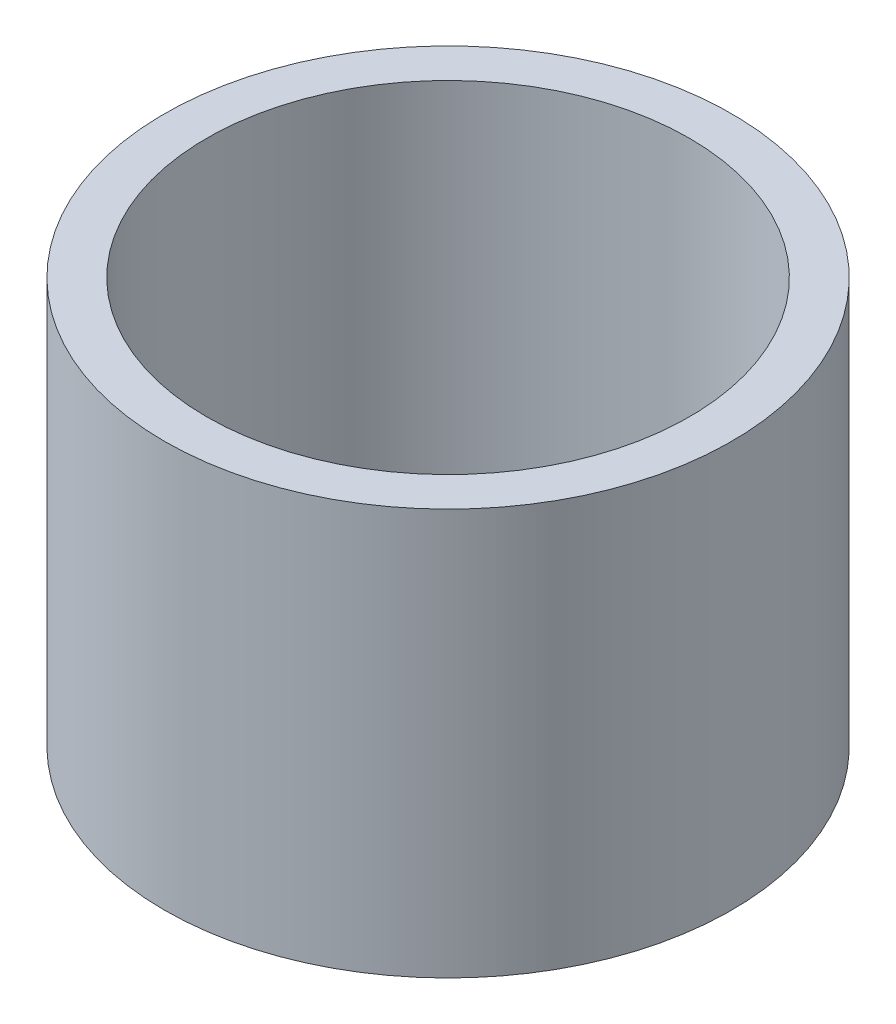
ISO-10303-21;
HEADER;
FILE_DESCRIPTION(('STEP AP214'),'2;1');
FILE_NAME('part.step','',(''),(''),'','','');
FILE_SCHEMA(('AUTOMOTIVE_DESIGN { 1 0 10303 214 1 1 1 1 }'));
ENDSEC;
DATA;
#1=APPLICATION_CONTEXT('core data for automotive mechanical design processes');
#2=APPLICATION_PROTOCOL_DEFINITION('international standard','automotive_design',2000,#1);
#3=PRODUCT_CONTEXT('',#1,'mechanical');
#4=PRODUCT('Part','Part','',(#3));
#5=PRODUCT_RELATED_PRODUCT_CATEGORY('part','',(#4));
#6=PRODUCT_DEFINITION_FORMATION('','',#4);
#7=PRODUCT_DEFINITION_CONTEXT('part definition',#1,'design');
#8=PRODUCT_DEFINITION('design','',#6,#7);
#9=PRODUCT_DEFINITION_SHAPE('','',#8);
#10=(LENGTH_UNIT() NAMED_UNIT(*) SI_UNIT(.MILLI.,.METRE.));
#11=(NAMED_UNIT(*) PLANE_ANGLE_UNIT() SI_UNIT($,.RADIAN.));
#12=(NAMED_UNIT(*) SI_UNIT($,.STERADIAN.) SOLID_ANGLE_UNIT());
#13=UNCERTAINTY_MEASURE_WITH_UNIT(LENGTH_MEASURE(1.E-05),#10,'distance_accuracy_value','');
#14=(GEOMETRIC_REPRESENTATION_CONTEXT(3) GLOBAL_UNCERTAINTY_ASSIGNED_CONTEXT((#13)) GLOBAL_UNIT_ASSIGNED_CONTEXT((#10,
#11,#12)) REPRESENTATION_CONTEXT('',''));
#15=CARTESIAN_POINT('',(0.,0.,0.));
#16=DIRECTION('',(0.,0.,1.));
#17=DIRECTION('',(1.,0.,0.));
#18=AXIS2_PLACEMENT_3D('',#15,#16,#17);
#19=CARTESIAN_POINT('',(0.,50.,0.));
#20=DIRECTION('',(0.,1.,0.));
#21=DIRECTION('',(0.,0.,1.));
#22=AXIS2_PLACEMENT_3D('',#19,#20,#21);
#23=PLANE('',#22);
#24=CARTESIAN_POINT('',(0.,50.,0.));
#25=DIRECTION('',(0.,1.,0.));
#26=DIRECTION('',(0.,0.,1.));
#27=AXIS2_PLACEMENT_3D('',#24,#25,#26);
#28=CIRCLE('',#27,34.93);
#29=CARTESIAN_POINT('',(0.,50.,34.93));
#30=VERTEX_POINT('',#29);
#31=EDGE_CURVE('E10',#30,#30,#28,.T.);
#32=ORIENTED_EDGE('',*,*,#31,.T.);
#33=EDGE_LOOP('',(#32));
#34=FACE_BOUND('',#33,.T.);
#35=CARTESIAN_POINT('',(0.,50.,0.));
#36=DIRECTION('',(0.,1.,0.));
#37=DIRECTION('',(0.,0.,1.));
#38=AXIS2_PLACEMENT_3D('',#35,#36,#37);
#39=CIRCLE('',#38,29.72);
#40=CARTESIAN_POINT('',(0.,50.,29.72));
#41=VERTEX_POINT('',#40);
#42=EDGE_CURVE('E48',#41,#41,#39,.T.);
#43=ORIENTED_EDGE('',*,*,#42,.F.);
#44=EDGE_LOOP('',(#43));
#45=FACE_BOUND('',#44,.T.);
#46=ADVANCED_FACE('F37',(#34,#45),#23,.T.);
#47=CARTESIAN_POINT('',(0.,0.,0.));
#48=DIRECTION('',(0.,1.,0.));
#49=DIRECTION('',(0.,0.,1.));
#50=AXIS2_PLACEMENT_3D('',#47,#48,#49);
#51=PLANE('',#50);
#52=CARTESIAN_POINT('',(0.,0.,0.));
#53=DIRECTION('',(0.,1.,0.));
#54=DIRECTION('',(0.,0.,1.));
#55=AXIS2_PLACEMENT_3D('',#52,#53,#54);
#56=CIRCLE('',#55,34.93);
#57=CARTESIAN_POINT('',(0.,0.,34.93));
#58=VERTEX_POINT('',#57);
#59=EDGE_CURVE('E41',#58,#58,#56,.T.);
#60=ORIENTED_EDGE('',*,*,#59,.F.);
#61=EDGE_LOOP('',(#60));
#62=FACE_BOUND('',#61,.T.);
#63=CARTESIAN_POINT('',(0.,0.,0.));
#64=DIRECTION('',(0.,1.,0.));
#65=DIRECTION('',(0.,0.,1.));
#66=AXIS2_PLACEMENT_3D('',#63,#64,#65);
#67=CIRCLE('',#66,29.72);
#68=CARTESIAN_POINT('',(0.,0.,29.72));
#69=VERTEX_POINT('',#68);
#70=EDGE_CURVE('E50',#69,#69,#67,.T.);
#71=ORIENTED_EDGE('',*,*,#70,.T.);
#72=EDGE_LOOP('',(#71));
#73=FACE_BOUND('',#72,.T.);
#74=ADVANCED_FACE('F60',(#62,#73),#51,.F.);
#75=CARTESIAN_POINT('',(0.,50.,0.));
#76=DIRECTION('',(0.,-1.,0.));
#77=DIRECTION('',(0.,0.,-1.));
#78=AXIS2_PLACEMENT_3D('',#75,#76,#77);
#79=CYLINDRICAL_SURFACE('',#78,34.93);
#80=ORIENTED_EDGE('',*,*,#31,.F.);
#81=EDGE_LOOP('',(#80));
#82=FACE_BOUND('',#81,.T.);
#83=ORIENTED_EDGE('',*,*,#59,.T.);
#84=EDGE_LOOP('',(#83));
#85=FACE_BOUND('',#84,.T.);
#86=ADVANCED_FACE('F39',(#82,#85),#79,.T.);
#87=CARTESIAN_POINT('',(0.,50.,0.));
#88=DIRECTION('',(0.,-1.,0.));
#89=DIRECTION('',(0.,0.,-1.));
#90=AXIS2_PLACEMENT_3D('',#87,#88,#89);
#91=CYLINDRICAL_SURFACE('',#90,29.72);
#92=ORIENTED_EDGE('',*,*,#42,.T.);
#93=EDGE_LOOP('',(#92));
#94=FACE_BOUND('',#93,.T.);
#95=ORIENTED_EDGE('',*,*,#70,.F.);
#96=EDGE_LOOP('',(#95));
#97=FACE_BOUND('',#96,.T.);
#98=ADVANCED_FACE('F56',(#94,#97),#91,.F.);
#99=CLOSED_SHELL('',(#46,#74,#86,#98));
#100=MANIFOLD_SOLID_BREP('B2',#99);
#101=ADVANCED_BREP_SHAPE_REPRESENTATION('',(#18,#100),#14);
#102=SHAPE_DEFINITION_REPRESENTATION(#9,#101);
ENDSEC;
END-ISO-10303-21;
